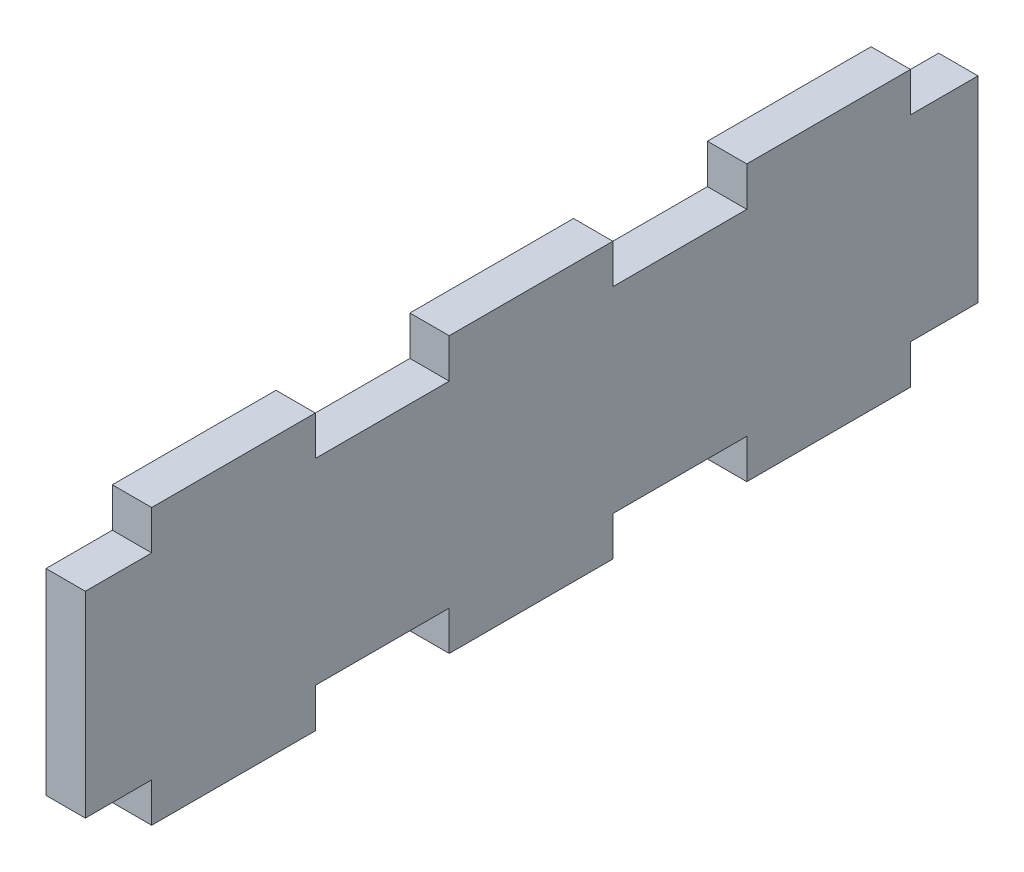
ISO-10303-21;
HEADER;
FILE_DESCRIPTION(('STEP AP214'),'2;1');
FILE_NAME('part.step','',(''),(''),'','','');
FILE_SCHEMA(('AUTOMOTIVE_DESIGN { 1 0 10303 214 1 1 1 1 }'));
ENDSEC;
DATA;
#1=APPLICATION_CONTEXT('core data for automotive mechanical design processes');
#2=APPLICATION_PROTOCOL_DEFINITION('international standard','automotive_design',2000,#1);
#3=PRODUCT_CONTEXT('',#1,'mechanical');
#4=PRODUCT('Part','Part','',(#3));
#5=PRODUCT_RELATED_PRODUCT_CATEGORY('part','',(#4));
#6=PRODUCT_DEFINITION_FORMATION('','',#4);
#7=PRODUCT_DEFINITION_CONTEXT('part definition',#1,'design');
#8=PRODUCT_DEFINITION('design','',#6,#7);
#9=PRODUCT_DEFINITION_SHAPE('','',#8);
#10=(LENGTH_UNIT() NAMED_UNIT(*) SI_UNIT(.MILLI.,.METRE.));
#11=(NAMED_UNIT(*) PLANE_ANGLE_UNIT() SI_UNIT($,.RADIAN.));
#12=(NAMED_UNIT(*) SI_UNIT($,.STERADIAN.) SOLID_ANGLE_UNIT());
#13=UNCERTAINTY_MEASURE_WITH_UNIT(LENGTH_MEASURE(1.E-05),#10,'distance_accuracy_value','');
#14=(GEOMETRIC_REPRESENTATION_CONTEXT(3) GLOBAL_UNCERTAINTY_ASSIGNED_CONTEXT((#13)) GLOBAL_UNIT_ASSIGNED_CONTEXT((#10,
#11,#12)) REPRESENTATION_CONTEXT('',''));
#15=CARTESIAN_POINT('',(0.,0.,0.));
#16=DIRECTION('',(0.,0.,1.));
#17=DIRECTION('',(1.,0.,0.));
#18=AXIS2_PLACEMENT_3D('',#15,#16,#17);
#19=CARTESIAN_POINT('',(1.5875,-5.55,-18.));
#20=DIRECTION('',(0.,0.,1.));
#21=DIRECTION('',(1.,0.,0.));
#22=AXIS2_PLACEMENT_3D('',#19,#20,#21);
#23=PLANE('',#22);
#24=DIRECTION('',(1.,0.,0.));
#25=VECTOR('',#24,1.);
#26=CARTESIAN_POINT('',(1.5875,-3.9625,-18.));
#27=LINE('',#26,#25);
#28=CARTESIAN_POINT('',(0.,-3.9625,-18.));
#29=VERTEX_POINT('',#28);
#30=CARTESIAN_POINT('',(1.5875,-3.9625,-18.));
#31=VERTEX_POINT('',#30);
#32=EDGE_CURVE('E427',#29,#31,#27,.T.);
#33=ORIENTED_EDGE('',*,*,#32,.F.);
#34=DIRECTION('',(0.,1.,0.));
#35=VECTOR('',#34,1.);
#36=CARTESIAN_POINT('',(0.,-5.55,-18.));
#37=LINE('',#36,#35);
#38=CARTESIAN_POINT('',(0.,3.9625,-18.));
#39=VERTEX_POINT('',#38);
#40=EDGE_CURVE('E287',#29,#39,#37,.T.);
#41=ORIENTED_EDGE('',*,*,#40,.T.);
#42=DIRECTION('',(1.,0.,0.));
#43=VECTOR('',#42,1.);
#44=CARTESIAN_POINT('',(1.5875,3.9625,-18.));
#45=LINE('',#44,#43);
#46=CARTESIAN_POINT('',(1.5875,3.9625,-18.));
#47=VERTEX_POINT('',#46);
#48=EDGE_CURVE('E308',#39,#47,#45,.T.);
#49=ORIENTED_EDGE('',*,*,#48,.T.);
#50=DIRECTION('',(0.,1.,0.));
#51=VECTOR('',#50,1.);
#52=CARTESIAN_POINT('',(1.5875,-5.55,-18.));
#53=LINE('',#52,#51);
#54=EDGE_CURVE('E255',#31,#47,#53,.T.);
#55=ORIENTED_EDGE('',*,*,#54,.F.);
#56=EDGE_LOOP('',(#33,#41,#49,#55));
#57=FACE_BOUND('',#56,.T.);
#58=ADVANCED_FACE('F39',(#57),#23,.F.);
#59=CARTESIAN_POINT('',(1.5875,-5.55,18.));
#60=DIRECTION('',(0.,0.,-1.));
#61=DIRECTION('',(-1.,0.,0.));
#62=AXIS2_PLACEMENT_3D('',#59,#60,#61);
#63=PLANE('',#62);
#64=DIRECTION('',(-1.,0.,0.));
#65=VECTOR('',#64,1.);
#66=CARTESIAN_POINT('',(1.5875,-3.96249999999983,18.));
#67=LINE('',#66,#65);
#68=CARTESIAN_POINT('',(1.5875,-3.96249999999983,18.));
#69=VERTEX_POINT('',#68);
#70=CARTESIAN_POINT('',(0.,-3.96249999999983,18.));
#71=VERTEX_POINT('',#70);
#72=EDGE_CURVE('E365',#69,#71,#67,.T.);
#73=ORIENTED_EDGE('',*,*,#72,.F.);
#74=DIRECTION('',(0.,-1.,0.));
#75=VECTOR('',#74,1.);
#76=CARTESIAN_POINT('',(1.5875,-5.55,18.));
#77=LINE('',#76,#75);
#78=CARTESIAN_POINT('',(1.5875,3.96249999999983,18.));
#79=VERTEX_POINT('',#78);
#80=EDGE_CURVE('E296',#79,#69,#77,.T.);
#81=ORIENTED_EDGE('',*,*,#80,.F.);
#82=DIRECTION('',(-1.,0.,0.));
#83=VECTOR('',#82,1.);
#84=CARTESIAN_POINT('',(1.5875,3.96249999999983,18.));
#85=LINE('',#84,#83);
#86=CARTESIAN_POINT('',(0.,3.96249999999983,18.));
#87=VERTEX_POINT('',#86);
#88=EDGE_CURVE('E290',#79,#87,#85,.T.);
#89=ORIENTED_EDGE('',*,*,#88,.T.);
#90=DIRECTION('',(0.,-1.,0.));
#91=VECTOR('',#90,1.);
#92=CARTESIAN_POINT('',(0.,-5.55,18.));
#93=LINE('',#92,#91);
#94=EDGE_CURVE('E267',#87,#71,#93,.T.);
#95=ORIENTED_EDGE('',*,*,#94,.T.);
#96=EDGE_LOOP('',(#73,#81,#89,#95));
#97=FACE_BOUND('',#96,.T.);
#98=ADVANCED_FACE('F550',(#97),#63,.F.);
#99=CARTESIAN_POINT('',(1.5875,-5.55,18.));
#100=DIRECTION('',(0.,1.,0.));
#101=DIRECTION('',(0.,0.,1.));
#102=AXIS2_PLACEMENT_3D('',#99,#100,#101);
#103=PLANE('',#102);
#104=DIRECTION('',(1.,0.,0.));
#105=VECTOR('',#104,1.);
#106=CARTESIAN_POINT('',(0.,-5.54999999999983,15.325));
#107=LINE('',#106,#105);
#108=CARTESIAN_POINT('',(0.,-5.54999999999983,15.325));
#109=VERTEX_POINT('',#108);
#110=CARTESIAN_POINT('',(1.5875,-5.54999999999983,15.325));
#111=VERTEX_POINT('',#110);
#112=EDGE_CURVE('E253',#109,#111,#107,.T.);
#113=ORIENTED_EDGE('',*,*,#112,.F.);
#114=DIRECTION('',(0.,0.,-1.));
#115=VECTOR('',#114,1.);
#116=CARTESIAN_POINT('',(0.,-5.55,18.));
#117=LINE('',#116,#115);
#118=CARTESIAN_POINT('',(0.,-5.54999999999992,8.725));
#119=VERTEX_POINT('',#118);
#120=EDGE_CURVE('E244',#109,#119,#117,.T.);
#121=ORIENTED_EDGE('',*,*,#120,.T.);
#122=DIRECTION('',(1.,0.,0.));
#123=VECTOR('',#122,1.);
#124=CARTESIAN_POINT('',(0.,-5.54999999999992,8.725));
#125=LINE('',#124,#123);
#126=CARTESIAN_POINT('',(1.5875,-5.54999999999992,8.725));
#127=VERTEX_POINT('',#126);
#128=EDGE_CURVE('E223',#119,#127,#125,.T.);
#129=ORIENTED_EDGE('',*,*,#128,.T.);
#130=DIRECTION('',(0.,0.,-1.));
#131=VECTOR('',#130,1.);
#132=CARTESIAN_POINT('',(1.5875,-5.55,18.));
#133=LINE('',#132,#131);
#134=EDGE_CURVE('E297',#111,#127,#133,.T.);
#135=ORIENTED_EDGE('',*,*,#134,.F.);
#136=EDGE_LOOP('',(#113,#121,#129,#135));
#137=FACE_BOUND('',#136,.T.);
#138=ADVANCED_FACE('F252',(#137),#103,.F.);
#139=DIRECTION('',(1.,0.,0.));
#140=VECTOR('',#139,1.);
#141=CARTESIAN_POINT('',(0.,-5.55,-15.275));
#142=LINE('',#141,#140);
#143=CARTESIAN_POINT('',(0.,-5.55,-15.275));
#144=VERTEX_POINT('',#143);
#145=CARTESIAN_POINT('',(1.5875,-5.55,-15.275));
#146=VERTEX_POINT('',#145);
#147=EDGE_CURVE('E483',#144,#146,#142,.T.);
#148=ORIENTED_EDGE('',*,*,#147,.T.);
#149=CARTESIAN_POINT('',(1.5875,-5.55,-8.675));
#150=VERTEX_POINT('',#149);
#151=EDGE_CURVE('E291',#150,#146,#133,.T.);
#152=ORIENTED_EDGE('',*,*,#151,.F.);
#153=DIRECTION('',(1.,0.,0.));
#154=VECTOR('',#153,1.);
#155=CARTESIAN_POINT('',(0.,-5.55,-8.675));
#156=LINE('',#155,#154);
#157=CARTESIAN_POINT('',(0.,-5.55,-8.675));
#158=VERTEX_POINT('',#157);
#159=EDGE_CURVE('E435',#158,#150,#156,.T.);
#160=ORIENTED_EDGE('',*,*,#159,.F.);
#161=EDGE_CURVE('E258',#158,#144,#117,.T.);
#162=ORIENTED_EDGE('',*,*,#161,.T.);
#163=EDGE_LOOP('',(#148,#152,#160,#162));
#164=FACE_BOUND('',#163,.T.);
#165=ADVANCED_FACE('F612',(#164),#103,.F.);
#166=DIRECTION('',(1.,0.,0.));
#167=VECTOR('',#166,1.);
#168=CARTESIAN_POINT('',(0.,-5.54999999999992,3.325));
#169=LINE('',#168,#167);
#170=CARTESIAN_POINT('',(0.,-5.54999999999992,3.325));
#171=VERTEX_POINT('',#170);
#172=CARTESIAN_POINT('',(1.5875,-5.54999999999992,3.325));
#173=VERTEX_POINT('',#172);
#174=EDGE_CURVE('E236',#171,#173,#169,.T.);
#175=ORIENTED_EDGE('',*,*,#174,.F.);
#176=CARTESIAN_POINT('',(0.,-5.55,-3.275));
#177=VERTEX_POINT('',#176);
#178=EDGE_CURVE('E256',#171,#177,#117,.T.);
#179=ORIENTED_EDGE('',*,*,#178,.T.);
#180=DIRECTION('',(1.,0.,0.));
#181=VECTOR('',#180,1.);
#182=CARTESIAN_POINT('',(0.,-5.55,-3.275));
#183=LINE('',#182,#181);
#184=CARTESIAN_POINT('',(1.5875,-5.55,-3.275));
#185=VERTEX_POINT('',#184);
#186=EDGE_CURVE('E431',#177,#185,#183,.T.);
#187=ORIENTED_EDGE('',*,*,#186,.T.);
#188=EDGE_CURVE('E295',#173,#185,#133,.T.);
#189=ORIENTED_EDGE('',*,*,#188,.F.);
#190=EDGE_LOOP('',(#175,#179,#187,#189));
#191=FACE_BOUND('',#190,.T.);
#192=ADVANCED_FACE('F527',(#191),#103,.F.);
#193=CARTESIAN_POINT('',(1.5875,0.,0.));
#194=DIRECTION('',(-1.,0.,0.));
#195=DIRECTION('',(0.,0.,1.));
#196=AXIS2_PLACEMENT_3D('',#193,#194,#195);
#197=PLANE('',#196);
#198=DIRECTION('',(0.,0.,-1.));
#199=VECTOR('',#198,1.);
#200=CARTESIAN_POINT('',(1.5875,-3.96249999999983,20.725));
#201=LINE('',#200,#199);
#202=CARTESIAN_POINT('',(1.5875,-3.96249999999983,15.325));
#203=VERTEX_POINT('',#202);
#204=EDGE_CURVE('E473',#69,#203,#201,.T.);
#205=ORIENTED_EDGE('',*,*,#204,.T.);
#206=DIRECTION('',(0.,-1.,0.));
#207=VECTOR('',#206,1.);
#208=CARTESIAN_POINT('',(1.5875,-5.54999999999983,15.325));
#209=LINE('',#208,#207);
#210=EDGE_CURVE('E477',#203,#111,#209,.T.);
#211=ORIENTED_EDGE('',*,*,#210,.T.);
#212=ORIENTED_EDGE('',*,*,#134,.T.);
#213=DIRECTION('',(0.,1.,0.));
#214=VECTOR('',#213,1.);
#215=CARTESIAN_POINT('',(1.5875,-5.54999999999992,8.725));
#216=LINE('',#215,#214);
#217=CARTESIAN_POINT('',(1.5875,-3.96249999999992,8.725));
#218=VERTEX_POINT('',#217);
#219=EDGE_CURVE('E230',#127,#218,#216,.T.);
#220=ORIENTED_EDGE('',*,*,#219,.T.);
#221=DIRECTION('',(0.,0.,-1.));
#222=VECTOR('',#221,1.);
#223=CARTESIAN_POINT('',(1.5875,-3.96249999999992,8.725));
#224=LINE('',#223,#222);
#225=CARTESIAN_POINT('',(1.5875,-3.96249999999992,3.325));
#226=VERTEX_POINT('',#225);
#227=EDGE_CURVE('E249',#218,#226,#224,.T.);
#228=ORIENTED_EDGE('',*,*,#227,.T.);
#229=DIRECTION('',(0.,-1.,0.));
#230=VECTOR('',#229,1.);
#231=CARTESIAN_POINT('',(1.5875,-5.54999999999992,3.325));
#232=LINE('',#231,#230);
#233=EDGE_CURVE('E511',#226,#173,#232,.T.);
#234=ORIENTED_EDGE('',*,*,#233,.T.);
#235=ORIENTED_EDGE('',*,*,#188,.T.);
#236=DIRECTION('',(0.,1.,0.));
#237=VECTOR('',#236,1.);
#238=CARTESIAN_POINT('',(1.5875,-5.55,-3.275));
#239=LINE('',#238,#237);
#240=CARTESIAN_POINT('',(1.5875,-3.9625,-3.275));
#241=VERTEX_POINT('',#240);
#242=EDGE_CURVE('E454',#185,#241,#239,.T.);
#243=ORIENTED_EDGE('',*,*,#242,.T.);
#244=DIRECTION('',(0.,0.,-1.));
#245=VECTOR('',#244,1.);
#246=CARTESIAN_POINT('',(1.5875,-3.9625,-3.275));
#247=LINE('',#246,#245);
#248=CARTESIAN_POINT('',(1.5875,-3.9625,-8.675));
#249=VERTEX_POINT('',#248);
#250=EDGE_CURVE('E445',#241,#249,#247,.T.);
#251=ORIENTED_EDGE('',*,*,#250,.T.);
#252=DIRECTION('',(0.,-1.,0.));
#253=VECTOR('',#252,1.);
#254=CARTESIAN_POINT('',(1.5875,-5.55,-8.675));
#255=LINE('',#254,#253);
#256=EDGE_CURVE('E450',#249,#150,#255,.T.);
#257=ORIENTED_EDGE('',*,*,#256,.T.);
#258=ORIENTED_EDGE('',*,*,#151,.T.);
#259=DIRECTION('',(0.,1.,0.));
#260=VECTOR('',#259,1.);
#261=CARTESIAN_POINT('',(1.5875,-5.55,-15.275));
#262=LINE('',#261,#260);
#263=CARTESIAN_POINT('',(1.5875,-3.9625,-15.275));
#264=VERTEX_POINT('',#263);
#265=EDGE_CURVE('E472',#146,#264,#262,.T.);
#266=ORIENTED_EDGE('',*,*,#265,.T.);
#267=DIRECTION('',(0.,0.,-1.));
#268=VECTOR('',#267,1.);
#269=CARTESIAN_POINT('',(1.5875,-3.9625,-15.275));
#270=LINE('',#269,#268);
#271=EDGE_CURVE('E489',#264,#31,#270,.T.);
#272=ORIENTED_EDGE('',*,*,#271,.T.);
#273=ORIENTED_EDGE('',*,*,#54,.T.);
#274=DIRECTION('',(0.,0.,-1.));
#275=VECTOR('',#274,1.);
#276=CARTESIAN_POINT('',(1.5875,3.9625,-15.275));
#277=LINE('',#276,#275);
#278=CARTESIAN_POINT('',(1.5875,3.9625,-15.275));
#279=VERTEX_POINT('',#278);
#280=EDGE_CURVE('E377',#279,#47,#277,.T.);
#281=ORIENTED_EDGE('',*,*,#280,.F.);
#282=DIRECTION('',(0.,-1.,0.));
#283=VECTOR('',#282,1.);
#284=CARTESIAN_POINT('',(1.5875,5.55,-15.275));
#285=LINE('',#284,#283);
#286=CARTESIAN_POINT('',(1.5875,5.55,-15.275));
#287=VERTEX_POINT('',#286);
#288=EDGE_CURVE('E358',#287,#279,#285,.T.);
#289=ORIENTED_EDGE('',*,*,#288,.F.);
#290=DIRECTION('',(0.,0.,1.));
#291=VECTOR('',#290,1.);
#292=CARTESIAN_POINT('',(1.5875,5.55,18.));
#293=LINE('',#292,#291);
#294=CARTESIAN_POINT('',(1.5875,5.55,-8.675));
#295=VERTEX_POINT('',#294);
#296=EDGE_CURVE('E301',#287,#295,#293,.T.);
#297=ORIENTED_EDGE('',*,*,#296,.T.);
#298=DIRECTION('',(0.,1.,0.));
#299=VECTOR('',#298,1.);
#300=CARTESIAN_POINT('',(1.5875,5.55,-8.675));
#301=LINE('',#300,#299);
#302=CARTESIAN_POINT('',(1.5875,3.9625,-8.675));
#303=VERTEX_POINT('',#302);
#304=EDGE_CURVE('E326',#303,#295,#301,.T.);
#305=ORIENTED_EDGE('',*,*,#304,.F.);
#306=DIRECTION('',(0.,0.,-1.));
#307=VECTOR('',#306,1.);
#308=CARTESIAN_POINT('',(1.5875,3.9625,-3.275));
#309=LINE('',#308,#307);
#310=CARTESIAN_POINT('',(1.5875,3.9625,-3.275));
#311=VERTEX_POINT('',#310);
#312=EDGE_CURVE('E330',#311,#303,#309,.T.);
#313=ORIENTED_EDGE('',*,*,#312,.F.);
#314=DIRECTION('',(0.,-1.,0.));
#315=VECTOR('',#314,1.);
#316=CARTESIAN_POINT('',(1.5875,5.55,-3.275));
#317=LINE('',#316,#315);
#318=CARTESIAN_POINT('',(1.5875,5.55,-3.275));
#319=VERTEX_POINT('',#318);
#320=EDGE_CURVE('E334',#319,#311,#317,.T.);
#321=ORIENTED_EDGE('',*,*,#320,.F.);
#322=CARTESIAN_POINT('',(1.5875,5.54999999999992,3.325));
#323=VERTEX_POINT('',#322);
#324=EDGE_CURVE('E304',#319,#323,#293,.T.);
#325=ORIENTED_EDGE('',*,*,#324,.T.);
#326=DIRECTION('',(0.,1.,0.));
#327=VECTOR('',#326,1.);
#328=CARTESIAN_POINT('',(1.5875,5.54999999999992,3.325));
#329=LINE('',#328,#327);
#330=CARTESIAN_POINT('',(1.5875,3.96249999999992,3.325));
#331=VERTEX_POINT('',#330);
#332=EDGE_CURVE('E404',#331,#323,#329,.T.);
#333=ORIENTED_EDGE('',*,*,#332,.F.);
#334=DIRECTION('',(0.,0.,-1.));
#335=VECTOR('',#334,1.);
#336=CARTESIAN_POINT('',(1.5875,3.96249999999992,8.725));
#337=LINE('',#336,#335);
#338=CARTESIAN_POINT('',(1.5875,3.96249999999992,8.725));
#339=VERTEX_POINT('',#338);
#340=EDGE_CURVE('E408',#339,#331,#337,.T.);
#341=ORIENTED_EDGE('',*,*,#340,.F.);
#342=DIRECTION('',(0.,-1.,0.));
#343=VECTOR('',#342,1.);
#344=CARTESIAN_POINT('',(1.5875,5.54999999999992,8.725));
#345=LINE('',#344,#343);
#346=CARTESIAN_POINT('',(1.5875,5.54999999999992,8.725));
#347=VERTEX_POINT('',#346);
#348=EDGE_CURVE('E376',#347,#339,#345,.T.);
#349=ORIENTED_EDGE('',*,*,#348,.F.);
#350=CARTESIAN_POINT('',(1.5875,5.54999999999983,15.325));
#351=VERTEX_POINT('',#350);
#352=EDGE_CURVE('E261',#347,#351,#293,.T.);
#353=ORIENTED_EDGE('',*,*,#352,.T.);
#354=DIRECTION('',(0.,1.,0.));
#355=VECTOR('',#354,1.);
#356=CARTESIAN_POINT('',(1.5875,5.54999999999983,15.325));
#357=LINE('',#356,#355);
#358=CARTESIAN_POINT('',(1.5875,3.96249999999983,15.325));
#359=VERTEX_POINT('',#358);
#360=EDGE_CURVE('E359',#359,#351,#357,.T.);
#361=ORIENTED_EDGE('',*,*,#360,.F.);
#362=DIRECTION('',(0.,0.,-1.));
#363=VECTOR('',#362,1.);
#364=CARTESIAN_POINT('',(1.5875,3.96249999999983,20.725));
#365=LINE('',#364,#363);
#366=EDGE_CURVE('E362',#79,#359,#365,.T.);
#367=ORIENTED_EDGE('',*,*,#366,.F.);
#368=ORIENTED_EDGE('',*,*,#80,.T.);
#369=EDGE_LOOP('',(#205,#211,#212,#220,#228,#234,#235,#243,#251,#257,#258,#266,#272,#273,#281,
#289,#297,#305,#313,#321,#325,#333,#341,#349,#353,#361,#367,#368));
#370=FACE_BOUND('',#369,.T.);
#371=ADVANCED_FACE('F539',(#370),#197,.F.);
#372=CARTESIAN_POINT('',(0.,0.,0.));
#373=DIRECTION('',(-1.,0.,0.));
#374=DIRECTION('',(0.,0.,1.));
#375=AXIS2_PLACEMENT_3D('',#372,#373,#374);
#376=PLANE('',#375);
#377=DIRECTION('',(0.,-1.,0.));
#378=VECTOR('',#377,1.);
#379=CARTESIAN_POINT('',(0.,-5.54999999999983,15.325));
#380=LINE('',#379,#378);
#381=CARTESIAN_POINT('',(0.,-3.96249999999983,15.325));
#382=VERTEX_POINT('',#381);
#383=EDGE_CURVE('E469',#382,#109,#380,.T.);
#384=ORIENTED_EDGE('',*,*,#383,.F.);
#385=DIRECTION('',(0.,0.,1.));
#386=VECTOR('',#385,1.);
#387=CARTESIAN_POINT('',(0.,-3.96249999999983,0.));
#388=LINE('',#387,#386);
#389=EDGE_CURVE('E11',#382,#71,#388,.T.);
#390=ORIENTED_EDGE('',*,*,#389,.T.);
#391=ORIENTED_EDGE('',*,*,#94,.F.);
#392=DIRECTION('',(0.,0.,1.));
#393=VECTOR('',#392,1.);
#394=CARTESIAN_POINT('',(0.,3.96249999999983,0.));
#395=LINE('',#394,#393);
#396=CARTESIAN_POINT('',(0.,3.96249999999983,15.325));
#397=VERTEX_POINT('',#396);
#398=EDGE_CURVE('E47',#397,#87,#395,.T.);
#399=ORIENTED_EDGE('',*,*,#398,.F.);
#400=DIRECTION('',(0.,1.,0.));
#401=VECTOR('',#400,1.);
#402=CARTESIAN_POINT('',(0.,5.54999999999983,15.325));
#403=LINE('',#402,#401);
#404=CARTESIAN_POINT('',(0.,5.54999999999983,15.325));
#405=VERTEX_POINT('',#404);
#406=EDGE_CURVE('E354',#397,#405,#403,.T.);
#407=ORIENTED_EDGE('',*,*,#406,.T.);
#408=DIRECTION('',(0.,0.,1.));
#409=VECTOR('',#408,1.);
#410=CARTESIAN_POINT('',(0.,5.55,18.));
#411=LINE('',#410,#409);
#412=CARTESIAN_POINT('',(0.,5.54999999999992,8.725));
#413=VERTEX_POINT('',#412);
#414=EDGE_CURVE('E283',#413,#405,#411,.T.);
#415=ORIENTED_EDGE('',*,*,#414,.F.);
#416=DIRECTION('',(0.,-1.,0.));
#417=VECTOR('',#416,1.);
#418=CARTESIAN_POINT('',(0.,5.54999999999992,8.725));
#419=LINE('',#418,#417);
#420=CARTESIAN_POINT('',(0.,3.96249999999992,8.725));
#421=VERTEX_POINT('',#420);
#422=EDGE_CURVE('E407',#413,#421,#419,.T.);
#423=ORIENTED_EDGE('',*,*,#422,.T.);
#424=DIRECTION('',(0.,0.,-1.));
#425=VECTOR('',#424,1.);
#426=CARTESIAN_POINT('',(0.,3.96249999999992,8.725));
#427=LINE('',#426,#425);
#428=CARTESIAN_POINT('',(0.,3.96249999999992,3.325));
#429=VERTEX_POINT('',#428);
#430=EDGE_CURVE('E418',#421,#429,#427,.T.);
#431=ORIENTED_EDGE('',*,*,#430,.T.);
#432=DIRECTION('',(0.,1.,0.));
#433=VECTOR('',#432,1.);
#434=CARTESIAN_POINT('',(0.,5.54999999999992,3.325));
#435=LINE('',#434,#433);
#436=CARTESIAN_POINT('',(0.,5.54999999999992,3.325));
#437=VERTEX_POINT('',#436);
#438=EDGE_CURVE('E395',#429,#437,#435,.T.);
#439=ORIENTED_EDGE('',*,*,#438,.T.);
#440=CARTESIAN_POINT('',(0.,5.55,-3.275));
#441=VERTEX_POINT('',#440);
#442=EDGE_CURVE('E281',#441,#437,#411,.T.);
#443=ORIENTED_EDGE('',*,*,#442,.F.);
#444=DIRECTION('',(0.,-1.,0.));
#445=VECTOR('',#444,1.);
#446=CARTESIAN_POINT('',(0.,5.55,-3.275));
#447=LINE('',#446,#445);
#448=CARTESIAN_POINT('',(0.,3.9625,-3.275));
#449=VERTEX_POINT('',#448);
#450=EDGE_CURVE('E329',#441,#449,#447,.T.);
#451=ORIENTED_EDGE('',*,*,#450,.T.);
#452=DIRECTION('',(0.,0.,-1.));
#453=VECTOR('',#452,1.);
#454=CARTESIAN_POINT('',(0.,3.9625,-3.275));
#455=LINE('',#454,#453);
#456=CARTESIAN_POINT('',(0.,3.9625,-8.675));
#457=VERTEX_POINT('',#456);
#458=EDGE_CURVE('E342',#449,#457,#455,.T.);
#459=ORIENTED_EDGE('',*,*,#458,.T.);
#460=DIRECTION('',(0.,1.,0.));
#461=VECTOR('',#460,1.);
#462=CARTESIAN_POINT('',(0.,5.55,-8.675));
#463=LINE('',#462,#461);
#464=CARTESIAN_POINT('',(0.,5.55,-8.675));
#465=VERTEX_POINT('',#464);
#466=EDGE_CURVE('E317',#457,#465,#463,.T.);
#467=ORIENTED_EDGE('',*,*,#466,.T.);
#468=CARTESIAN_POINT('',(0.,5.55,-15.275));
#469=VERTEX_POINT('',#468);
#470=EDGE_CURVE('E274',#469,#465,#411,.T.);
#471=ORIENTED_EDGE('',*,*,#470,.F.);
#472=DIRECTION('',(0.,-1.,0.));
#473=VECTOR('',#472,1.);
#474=CARTESIAN_POINT('',(0.,5.55,-15.275));
#475=LINE('',#474,#473);
#476=CARTESIAN_POINT('',(0.,3.9625,-15.275));
#477=VERTEX_POINT('',#476);
#478=EDGE_CURVE('E381',#469,#477,#475,.T.);
#479=ORIENTED_EDGE('',*,*,#478,.T.);
#480=DIRECTION('',(0.,0.,-1.));
#481=VECTOR('',#480,1.);
#482=CARTESIAN_POINT('',(0.,3.9625,-15.275));
#483=LINE('',#482,#481);
#484=EDGE_CURVE('E373',#477,#39,#483,.T.);
#485=ORIENTED_EDGE('',*,*,#484,.T.);
#486=ORIENTED_EDGE('',*,*,#40,.F.);
#487=DIRECTION('',(0.,0.,-1.));
#488=VECTOR('',#487,1.);
#489=CARTESIAN_POINT('',(0.,-3.9625,-15.275));
#490=LINE('',#489,#488);
#491=CARTESIAN_POINT('',(0.,-3.9625,-15.275));
#492=VERTEX_POINT('',#491);
#493=EDGE_CURVE('E486',#492,#29,#490,.T.);
#494=ORIENTED_EDGE('',*,*,#493,.F.);
#495=DIRECTION('',(0.,1.,0.));
#496=VECTOR('',#495,1.);
#497=CARTESIAN_POINT('',(0.,-5.55,-15.275));
#498=LINE('',#497,#496);
#499=EDGE_CURVE('E493',#144,#492,#498,.T.);
#500=ORIENTED_EDGE('',*,*,#499,.F.);
#501=ORIENTED_EDGE('',*,*,#161,.F.);
#502=DIRECTION('',(0.,-1.,0.));
#503=VECTOR('',#502,1.);
#504=CARTESIAN_POINT('',(0.,-5.55,-8.675));
#505=LINE('',#504,#503);
#506=CARTESIAN_POINT('',(0.,-3.9625,-8.675));
#507=VERTEX_POINT('',#506);
#508=EDGE_CURVE('E462',#507,#158,#505,.T.);
#509=ORIENTED_EDGE('',*,*,#508,.F.);
#510=DIRECTION('',(0.,0.,-1.));
#511=VECTOR('',#510,1.);
#512=CARTESIAN_POINT('',(0.,-3.9625,-3.275));
#513=LINE('',#512,#511);
#514=CARTESIAN_POINT('',(0.,-3.9625,-3.275));
#515=VERTEX_POINT('',#514);
#516=EDGE_CURVE('E436',#515,#507,#513,.T.);
#517=ORIENTED_EDGE('',*,*,#516,.F.);
#518=DIRECTION('',(0.,1.,0.));
#519=VECTOR('',#518,1.);
#520=CARTESIAN_POINT('',(0.,-5.55,-3.275));
#521=LINE('',#520,#519);
#522=EDGE_CURVE('E449',#177,#515,#521,.T.);
#523=ORIENTED_EDGE('',*,*,#522,.F.);
#524=ORIENTED_EDGE('',*,*,#178,.F.);
#525=DIRECTION('',(0.,-1.,0.));
#526=VECTOR('',#525,1.);
#527=CARTESIAN_POINT('',(0.,-5.54999999999992,3.325));
#528=LINE('',#527,#526);
#529=CARTESIAN_POINT('',(0.,-3.96249999999992,3.325));
#530=VERTEX_POINT('',#529);
#531=EDGE_CURVE('E248',#530,#171,#528,.T.);
#532=ORIENTED_EDGE('',*,*,#531,.F.);
#533=DIRECTION('',(0.,0.,-1.));
#534=VECTOR('',#533,1.);
#535=CARTESIAN_POINT('',(0.,-3.96249999999992,8.725));
#536=LINE('',#535,#534);
#537=CARTESIAN_POINT('',(0.,-3.96249999999992,8.725));
#538=VERTEX_POINT('',#537);
#539=EDGE_CURVE('E237',#538,#530,#536,.T.);
#540=ORIENTED_EDGE('',*,*,#539,.F.);
#541=DIRECTION('',(0.,1.,0.));
#542=VECTOR('',#541,1.);
#543=CARTESIAN_POINT('',(0.,-5.54999999999992,8.725));
#544=LINE('',#543,#542);
#545=EDGE_CURVE('E227',#119,#538,#544,.T.);
#546=ORIENTED_EDGE('',*,*,#545,.F.);
#547=ORIENTED_EDGE('',*,*,#120,.F.);
#548=EDGE_LOOP('',(#384,#390,#391,#399,#407,#415,#423,#431,#439,#443,#451,#459,#467,#471,#479,
#485,#486,#494,#500,#501,#509,#517,#523,#524,#532,#540,#546,#547));
#549=FACE_BOUND('',#548,.T.);
#550=ADVANCED_FACE('F243',(#549),#376,.T.);
#551=CARTESIAN_POINT('',(1.5875,5.55,18.));
#552=DIRECTION('',(0.,-1.,0.));
#553=DIRECTION('',(0.,0.,-1.));
#554=AXIS2_PLACEMENT_3D('',#551,#552,#553);
#555=PLANE('',#554);
#556=ORIENTED_EDGE('',*,*,#414,.T.);
#557=DIRECTION('',(1.,0.,0.));
#558=VECTOR('',#557,1.);
#559=CARTESIAN_POINT('',(0.,5.54999999999983,15.325));
#560=LINE('',#559,#558);
#561=EDGE_CURVE('E353',#405,#351,#560,.T.);
#562=ORIENTED_EDGE('',*,*,#561,.T.);
#563=ORIENTED_EDGE('',*,*,#352,.F.);
#564=DIRECTION('',(1.,0.,0.));
#565=VECTOR('',#564,1.);
#566=CARTESIAN_POINT('',(0.,5.54999999999992,8.725));
#567=LINE('',#566,#565);
#568=EDGE_CURVE('E338',#413,#347,#567,.T.);
#569=ORIENTED_EDGE('',*,*,#568,.F.);
#570=EDGE_LOOP('',(#556,#562,#563,#569));
#571=FACE_BOUND('',#570,.T.);
#572=ADVANCED_FACE('F559',(#571),#555,.F.);
#573=ORIENTED_EDGE('',*,*,#442,.T.);
#574=DIRECTION('',(1.,0.,0.));
#575=VECTOR('',#574,1.);
#576=CARTESIAN_POINT('',(0.,5.54999999999992,3.325));
#577=LINE('',#576,#575);
#578=EDGE_CURVE('E398',#437,#323,#577,.T.);
#579=ORIENTED_EDGE('',*,*,#578,.T.);
#580=ORIENTED_EDGE('',*,*,#324,.F.);
#581=DIRECTION('',(1.,0.,0.));
#582=VECTOR('',#581,1.);
#583=CARTESIAN_POINT('',(0.,5.55,-3.275));
#584=LINE('',#583,#582);
#585=EDGE_CURVE('E312',#441,#319,#584,.T.);
#586=ORIENTED_EDGE('',*,*,#585,.F.);
#587=EDGE_LOOP('',(#573,#579,#580,#586));
#588=FACE_BOUND('',#587,.T.);
#589=ADVANCED_FACE('F576',(#588),#555,.F.);
#590=ORIENTED_EDGE('',*,*,#296,.F.);
#591=DIRECTION('',(1.,0.,0.));
#592=VECTOR('',#591,1.);
#593=CARTESIAN_POINT('',(0.,5.55,-15.275));
#594=LINE('',#593,#592);
#595=EDGE_CURVE('E372',#469,#287,#594,.T.);
#596=ORIENTED_EDGE('',*,*,#595,.F.);
#597=ORIENTED_EDGE('',*,*,#470,.T.);
#598=DIRECTION('',(1.,0.,0.));
#599=VECTOR('',#598,1.);
#600=CARTESIAN_POINT('',(0.,5.55,-8.675));
#601=LINE('',#600,#599);
#602=EDGE_CURVE('E320',#465,#295,#601,.T.);
#603=ORIENTED_EDGE('',*,*,#602,.T.);
#604=EDGE_LOOP('',(#590,#596,#597,#603));
#605=FACE_BOUND('',#604,.T.);
#606=ADVANCED_FACE('F594',(#605),#555,.F.);
#607=CARTESIAN_POINT('',(0.,5.55,-3.275));
#608=DIRECTION('',(0.,0.,1.));
#609=DIRECTION('',(0.,-1.,0.));
#610=AXIS2_PLACEMENT_3D('',#607,#608,#609);
#611=PLANE('',#610);
#612=ORIENTED_EDGE('',*,*,#320,.T.);
#613=DIRECTION('',(1.,0.,0.));
#614=VECTOR('',#613,1.);
#615=CARTESIAN_POINT('',(0.,3.9625,-3.275));
#616=LINE('',#615,#614);
#617=EDGE_CURVE('E313',#449,#311,#616,.T.);
#618=ORIENTED_EDGE('',*,*,#617,.F.);
#619=ORIENTED_EDGE('',*,*,#450,.F.);
#620=ORIENTED_EDGE('',*,*,#585,.T.);
#621=EDGE_LOOP('',(#612,#618,#619,#620));
#622=FACE_BOUND('',#621,.T.);
#623=ADVANCED_FACE('F581',(#622),#611,.F.);
#624=CARTESIAN_POINT('',(0.,5.55,-8.675));
#625=DIRECTION('',(0.,0.,-1.));
#626=DIRECTION('',(-1.,0.,0.));
#627=AXIS2_PLACEMENT_3D('',#624,#625,#626);
#628=PLANE('',#627);
#629=ORIENTED_EDGE('',*,*,#304,.T.);
#630=ORIENTED_EDGE('',*,*,#602,.F.);
#631=ORIENTED_EDGE('',*,*,#466,.F.);
#632=DIRECTION('',(1.,0.,0.));
#633=VECTOR('',#632,1.);
#634=CARTESIAN_POINT('',(0.,3.9625,-8.675));
#635=LINE('',#634,#633);
#636=EDGE_CURVE('E316',#457,#303,#635,.T.);
#637=ORIENTED_EDGE('',*,*,#636,.T.);
#638=EDGE_LOOP('',(#629,#630,#631,#637));
#639=FACE_BOUND('',#638,.T.);
#640=ADVANCED_FACE('F640',(#639),#628,.F.);
#641=CARTESIAN_POINT('',(0.,3.9625,-3.275));
#642=DIRECTION('',(0.,-1.,0.));
#643=DIRECTION('',(0.,0.,-1.));
#644=AXIS2_PLACEMENT_3D('',#641,#642,#643);
#645=PLANE('',#644);
#646=ORIENTED_EDGE('',*,*,#312,.T.);
#647=ORIENTED_EDGE('',*,*,#636,.F.);
#648=ORIENTED_EDGE('',*,*,#458,.F.);
#649=ORIENTED_EDGE('',*,*,#617,.T.);
#650=EDGE_LOOP('',(#646,#647,#648,#649));
#651=FACE_BOUND('',#650,.T.);
#652=ADVANCED_FACE('F587',(#651),#645,.F.);
#653=CARTESIAN_POINT('',(0.,5.54999999999992,8.725));
#654=DIRECTION('',(0.,0.,1.));
#655=DIRECTION('',(1.,0.,0.));
#656=AXIS2_PLACEMENT_3D('',#653,#654,#655);
#657=PLANE('',#656);
#658=ORIENTED_EDGE('',*,*,#348,.T.);
#659=DIRECTION('',(1.,0.,0.));
#660=VECTOR('',#659,1.);
#661=CARTESIAN_POINT('',(0.,3.96249999999992,8.725));
#662=LINE('',#661,#660);
#663=EDGE_CURVE('E391',#421,#339,#662,.T.);
#664=ORIENTED_EDGE('',*,*,#663,.F.);
#665=ORIENTED_EDGE('',*,*,#422,.F.);
#666=ORIENTED_EDGE('',*,*,#568,.T.);
#667=EDGE_LOOP('',(#658,#664,#665,#666));
#668=FACE_BOUND('',#667,.T.);
#669=ADVANCED_FACE('F563',(#668),#657,.F.);
#670=CARTESIAN_POINT('',(0.,5.54999999999992,3.325));
#671=DIRECTION('',(0.,0.,-1.));
#672=DIRECTION('',(-1.,0.,0.));
#673=AXIS2_PLACEMENT_3D('',#670,#671,#672);
#674=PLANE('',#673);
#675=ORIENTED_EDGE('',*,*,#332,.T.);
#676=ORIENTED_EDGE('',*,*,#578,.F.);
#677=ORIENTED_EDGE('',*,*,#438,.F.);
#678=DIRECTION('',(1.,0.,0.));
#679=VECTOR('',#678,1.);
#680=CARTESIAN_POINT('',(0.,3.96249999999992,3.325));
#681=LINE('',#680,#679);
#682=EDGE_CURVE('E394',#429,#331,#681,.T.);
#683=ORIENTED_EDGE('',*,*,#682,.T.);
#684=EDGE_LOOP('',(#675,#676,#677,#683));
#685=FACE_BOUND('',#684,.T.);
#686=ADVANCED_FACE('F665',(#685),#674,.F.);
#687=CARTESIAN_POINT('',(0.,3.96249999999992,8.725));
#688=DIRECTION('',(0.,-1.,0.));
#689=DIRECTION('',(0.,0.,-1.));
#690=AXIS2_PLACEMENT_3D('',#687,#688,#689);
#691=PLANE('',#690);
#692=ORIENTED_EDGE('',*,*,#340,.T.);
#693=ORIENTED_EDGE('',*,*,#682,.F.);
#694=ORIENTED_EDGE('',*,*,#430,.F.);
#695=ORIENTED_EDGE('',*,*,#663,.T.);
#696=EDGE_LOOP('',(#692,#693,#694,#695));
#697=FACE_BOUND('',#696,.T.);
#698=ADVANCED_FACE('F569',(#697),#691,.F.);
#699=CARTESIAN_POINT('',(0.,3.9625,-15.275));
#700=DIRECTION('',(0.,-1.,0.));
#701=DIRECTION('',(0.,0.,-1.));
#702=AXIS2_PLACEMENT_3D('',#699,#700,#701);
#703=PLANE('',#702);
#704=ORIENTED_EDGE('',*,*,#484,.F.);
#705=DIRECTION('',(1.,0.,0.));
#706=VECTOR('',#705,1.);
#707=CARTESIAN_POINT('',(0.,3.9625,-15.275));
#708=LINE('',#707,#706);
#709=EDGE_CURVE('E369',#477,#279,#708,.T.);
#710=ORIENTED_EDGE('',*,*,#709,.T.);
#711=ORIENTED_EDGE('',*,*,#280,.T.);
#712=ORIENTED_EDGE('',*,*,#48,.F.);
#713=EDGE_LOOP('',(#704,#710,#711,#712));
#714=FACE_BOUND('',#713,.T.);
#715=ADVANCED_FACE('F603',(#714),#703,.F.);
#716=CARTESIAN_POINT('',(0.,5.55,-15.275));
#717=DIRECTION('',(0.,0.,1.));
#718=DIRECTION('',(1.,0.,0.));
#719=AXIS2_PLACEMENT_3D('',#716,#717,#718);
#720=PLANE('',#719);
#721=ORIENTED_EDGE('',*,*,#288,.T.);
#722=ORIENTED_EDGE('',*,*,#709,.F.);
#723=ORIENTED_EDGE('',*,*,#478,.F.);
#724=ORIENTED_EDGE('',*,*,#595,.T.);
#725=EDGE_LOOP('',(#721,#722,#723,#724));
#726=FACE_BOUND('',#725,.T.);
#727=ADVANCED_FACE('F597',(#726),#720,.F.);
#728=CARTESIAN_POINT('',(0.,3.96249999999983,20.725));
#729=DIRECTION('',(0.,-1.,0.));
#730=DIRECTION('',(0.,0.,-1.));
#731=AXIS2_PLACEMENT_3D('',#728,#729,#730);
#732=PLANE('',#731);
#733=ORIENTED_EDGE('',*,*,#366,.T.);
#734=DIRECTION('',(1.,0.,0.));
#735=VECTOR('',#734,1.);
#736=CARTESIAN_POINT('',(0.,3.96249999999983,15.325));
#737=LINE('',#736,#735);
#738=EDGE_CURVE('E349',#397,#359,#737,.T.);
#739=ORIENTED_EDGE('',*,*,#738,.F.);
#740=ORIENTED_EDGE('',*,*,#398,.T.);
#741=ORIENTED_EDGE('',*,*,#88,.F.);
#742=EDGE_LOOP('',(#733,#739,#740,#741));
#743=FACE_BOUND('',#742,.T.);
#744=ADVANCED_FACE('F547',(#743),#732,.F.);
#745=CARTESIAN_POINT('',(0.,5.54999999999983,15.325));
#746=DIRECTION('',(0.,0.,-1.));
#747=DIRECTION('',(-1.,0.,0.));
#748=AXIS2_PLACEMENT_3D('',#745,#746,#747);
#749=PLANE('',#748);
#750=ORIENTED_EDGE('',*,*,#360,.T.);
#751=ORIENTED_EDGE('',*,*,#561,.F.);
#752=ORIENTED_EDGE('',*,*,#406,.F.);
#753=ORIENTED_EDGE('',*,*,#738,.T.);
#754=EDGE_LOOP('',(#750,#751,#752,#753));
#755=FACE_BOUND('',#754,.T.);
#756=ADVANCED_FACE('F555',(#755),#749,.F.);
#757=CARTESIAN_POINT('',(0.,-5.55,-3.275));
#758=DIRECTION('',(0.,0.,-1.));
#759=DIRECTION('',(0.,1.,0.));
#760=AXIS2_PLACEMENT_3D('',#757,#758,#759);
#761=PLANE('',#760);
#762=ORIENTED_EDGE('',*,*,#242,.F.);
#763=ORIENTED_EDGE('',*,*,#186,.F.);
#764=ORIENTED_EDGE('',*,*,#522,.T.);
#765=DIRECTION('',(1.,0.,0.));
#766=VECTOR('',#765,1.);
#767=CARTESIAN_POINT('',(0.,-3.9625,-3.275));
#768=LINE('',#767,#766);
#769=EDGE_CURVE('E430',#515,#241,#768,.T.);
#770=ORIENTED_EDGE('',*,*,#769,.T.);
#771=EDGE_LOOP('',(#762,#763,#764,#770));
#772=FACE_BOUND('',#771,.T.);
#773=ADVANCED_FACE('F534',(#772),#761,.T.);
#774=CARTESIAN_POINT('',(0.,-3.9625,-3.275));
#775=DIRECTION('',(0.,-1.,0.));
#776=DIRECTION('',(0.,0.,-1.));
#777=AXIS2_PLACEMENT_3D('',#774,#775,#776);
#778=PLANE('',#777);
#779=ORIENTED_EDGE('',*,*,#250,.F.);
#780=ORIENTED_EDGE('',*,*,#769,.F.);
#781=ORIENTED_EDGE('',*,*,#516,.T.);
#782=DIRECTION('',(1.,0.,0.));
#783=VECTOR('',#782,1.);
#784=CARTESIAN_POINT('',(0.,-3.9625,-8.675));
#785=LINE('',#784,#783);
#786=EDGE_CURVE('E439',#507,#249,#785,.T.);
#787=ORIENTED_EDGE('',*,*,#786,.T.);
#788=EDGE_LOOP('',(#779,#780,#781,#787));
#789=FACE_BOUND('',#788,.T.);
#790=ADVANCED_FACE('F536',(#789),#778,.T.);
#791=CARTESIAN_POINT('',(0.,-5.55,-8.675));
#792=DIRECTION('',(0.,0.,1.));
#793=DIRECTION('',(1.,0.,0.));
#794=AXIS2_PLACEMENT_3D('',#791,#792,#793);
#795=PLANE('',#794);
#796=ORIENTED_EDGE('',*,*,#256,.F.);
#797=ORIENTED_EDGE('',*,*,#786,.F.);
#798=ORIENTED_EDGE('',*,*,#508,.T.);
#799=ORIENTED_EDGE('',*,*,#159,.T.);
#800=EDGE_LOOP('',(#796,#797,#798,#799));
#801=FACE_BOUND('',#800,.T.);
#802=ADVANCED_FACE('F614',(#801),#795,.T.);
#803=CARTESIAN_POINT('',(0.,-5.54999999999992,8.725));
#804=DIRECTION('',(0.,0.,-1.));
#805=DIRECTION('',(-1.,0.,0.));
#806=AXIS2_PLACEMENT_3D('',#803,#804,#805);
#807=PLANE('',#806);
#808=ORIENTED_EDGE('',*,*,#219,.F.);
#809=ORIENTED_EDGE('',*,*,#128,.F.);
#810=ORIENTED_EDGE('',*,*,#545,.T.);
#811=DIRECTION('',(1.,0.,0.));
#812=VECTOR('',#811,1.);
#813=CARTESIAN_POINT('',(0.,-3.96249999999992,8.725));
#814=LINE('',#813,#812);
#815=EDGE_CURVE('E458',#538,#218,#814,.T.);
#816=ORIENTED_EDGE('',*,*,#815,.T.);
#817=EDGE_LOOP('',(#808,#809,#810,#816));
#818=FACE_BOUND('',#817,.T.);
#819=ADVANCED_FACE('F225',(#818),#807,.T.);
#820=CARTESIAN_POINT('',(0.,-3.96249999999992,8.725));
#821=DIRECTION('',(0.,-1.,0.));
#822=DIRECTION('',(0.,0.,-1.));
#823=AXIS2_PLACEMENT_3D('',#820,#821,#822);
#824=PLANE('',#823);
#825=ORIENTED_EDGE('',*,*,#227,.F.);
#826=ORIENTED_EDGE('',*,*,#815,.F.);
#827=ORIENTED_EDGE('',*,*,#539,.T.);
#828=DIRECTION('',(1.,0.,0.));
#829=VECTOR('',#828,1.);
#830=CARTESIAN_POINT('',(0.,-3.96249999999992,3.325));
#831=LINE('',#830,#829);
#832=EDGE_CURVE('E503',#530,#226,#831,.T.);
#833=ORIENTED_EDGE('',*,*,#832,.T.);
#834=EDGE_LOOP('',(#825,#826,#827,#833));
#835=FACE_BOUND('',#834,.T.);
#836=ADVANCED_FACE('F621',(#835),#824,.T.);
#837=CARTESIAN_POINT('',(0.,-5.54999999999992,3.325));
#838=DIRECTION('',(0.,0.,1.));
#839=DIRECTION('',(1.,0.,0.));
#840=AXIS2_PLACEMENT_3D('',#837,#838,#839);
#841=PLANE('',#840);
#842=ORIENTED_EDGE('',*,*,#233,.F.);
#843=ORIENTED_EDGE('',*,*,#832,.F.);
#844=ORIENTED_EDGE('',*,*,#531,.T.);
#845=ORIENTED_EDGE('',*,*,#174,.T.);
#846=EDGE_LOOP('',(#842,#843,#844,#845));
#847=FACE_BOUND('',#846,.T.);
#848=ADVANCED_FACE('F523',(#847),#841,.T.);
#849=CARTESIAN_POINT('',(0.,-3.9625,-15.275));
#850=DIRECTION('',(0.,-1.,0.));
#851=DIRECTION('',(0.,0.,-1.));
#852=AXIS2_PLACEMENT_3D('',#849,#850,#851);
#853=PLANE('',#852);
#854=ORIENTED_EDGE('',*,*,#32,.T.);
#855=ORIENTED_EDGE('',*,*,#271,.F.);
#856=DIRECTION('',(1.,0.,0.));
#857=VECTOR('',#856,1.);
#858=CARTESIAN_POINT('',(0.,-3.9625,-15.275));
#859=LINE('',#858,#857);
#860=EDGE_CURVE('E62',#492,#264,#859,.T.);
#861=ORIENTED_EDGE('',*,*,#860,.F.);
#862=ORIENTED_EDGE('',*,*,#493,.T.);
#863=EDGE_LOOP('',(#854,#855,#861,#862));
#864=FACE_BOUND('',#863,.T.);
#865=ADVANCED_FACE('F609',(#864),#853,.T.);
#866=CARTESIAN_POINT('',(0.,-5.55,-15.275));
#867=DIRECTION('',(0.,0.,-1.));
#868=DIRECTION('',(-1.,0.,0.));
#869=AXIS2_PLACEMENT_3D('',#866,#867,#868);
#870=PLANE('',#869);
#871=ORIENTED_EDGE('',*,*,#265,.F.);
#872=ORIENTED_EDGE('',*,*,#147,.F.);
#873=ORIENTED_EDGE('',*,*,#499,.T.);
#874=ORIENTED_EDGE('',*,*,#860,.T.);
#875=EDGE_LOOP('',(#871,#872,#873,#874));
#876=FACE_BOUND('',#875,.T.);
#877=ADVANCED_FACE('F611',(#876),#870,.T.);
#878=CARTESIAN_POINT('',(0.,-3.96249999999983,20.725));
#879=DIRECTION('',(0.,-1.,0.));
#880=DIRECTION('',(0.,0.,-1.));
#881=AXIS2_PLACEMENT_3D('',#878,#879,#880);
#882=PLANE('',#881);
#883=ORIENTED_EDGE('',*,*,#72,.T.);
#884=ORIENTED_EDGE('',*,*,#389,.F.);
#885=DIRECTION('',(1.,0.,0.));
#886=VECTOR('',#885,1.);
#887=CARTESIAN_POINT('',(0.,-3.96249999999983,15.325));
#888=LINE('',#887,#886);
#889=EDGE_CURVE('E54',#382,#203,#888,.T.);
#890=ORIENTED_EDGE('',*,*,#889,.T.);
#891=ORIENTED_EDGE('',*,*,#204,.F.);
#892=EDGE_LOOP('',(#883,#884,#890,#891));
#893=FACE_BOUND('',#892,.T.);
#894=ADVANCED_FACE('F552',(#893),#882,.T.);
#895=CARTESIAN_POINT('',(0.,-5.54999999999983,15.325));
#896=DIRECTION('',(0.,0.,1.));
#897=DIRECTION('',(1.,0.,0.));
#898=AXIS2_PLACEMENT_3D('',#895,#896,#897);
#899=PLANE('',#898);
#900=ORIENTED_EDGE('',*,*,#210,.F.);
#901=ORIENTED_EDGE('',*,*,#889,.F.);
#902=ORIENTED_EDGE('',*,*,#383,.T.);
#903=ORIENTED_EDGE('',*,*,#112,.T.);
#904=EDGE_LOOP('',(#900,#901,#902,#903));
#905=FACE_BOUND('',#904,.T.);
#906=ADVANCED_FACE('F730',(#905),#899,.T.);
#907=CLOSED_SHELL('',(#58,#98,#138,#165,#192,#371,#550,#572,#589,#606,#623,#640,#652,#669,#686,
#698,#715,#727,#744,#756,#773,#790,#802,#819,#836,#848,#865,#877,#894,#906));
#908=MANIFOLD_SOLID_BREP('B2',#907);
#909=ADVANCED_BREP_SHAPE_REPRESENTATION('',(#18,#908),#14);
#910=SHAPE_DEFINITION_REPRESENTATION(#9,#909);
ENDSEC;
END-ISO-10303-21;
